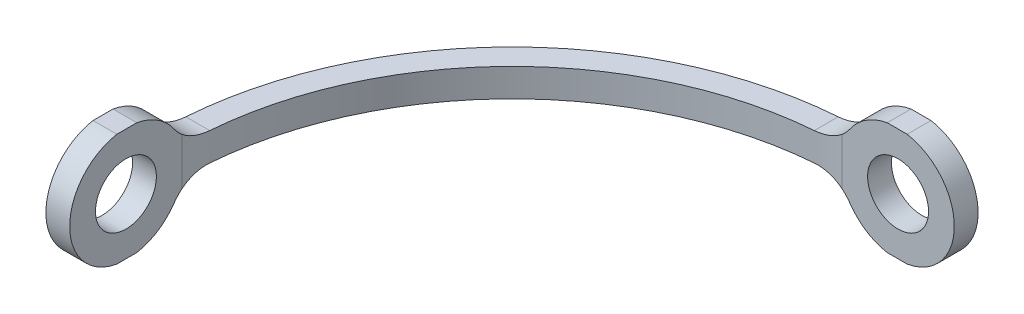
ISO-10303-21;
HEADER;
FILE_DESCRIPTION(('STEP AP214'),'2;1');
FILE_NAME('part.step','',(''),(''),'','','');
FILE_SCHEMA(('AUTOMOTIVE_DESIGN { 1 0 10303 214 1 1 1 1 }'));
ENDSEC;
DATA;
#1=APPLICATION_CONTEXT('core data for automotive mechanical design processes');
#2=APPLICATION_PROTOCOL_DEFINITION('international standard','automotive_design',2000,#1);
#3=PRODUCT_CONTEXT('',#1,'mechanical');
#4=PRODUCT('Part','Part','',(#3));
#5=PRODUCT_RELATED_PRODUCT_CATEGORY('part','',(#4));
#6=PRODUCT_DEFINITION_FORMATION('','',#4);
#7=PRODUCT_DEFINITION_CONTEXT('part definition',#1,'design');
#8=PRODUCT_DEFINITION('design','',#6,#7);
#9=PRODUCT_DEFINITION_SHAPE('','',#8);
#10=(LENGTH_UNIT() NAMED_UNIT(*) SI_UNIT(.MILLI.,.METRE.));
#11=(NAMED_UNIT(*) PLANE_ANGLE_UNIT() SI_UNIT($,.RADIAN.));
#12=(NAMED_UNIT(*) SI_UNIT($,.STERADIAN.) SOLID_ANGLE_UNIT());
#13=UNCERTAINTY_MEASURE_WITH_UNIT(LENGTH_MEASURE(1.E-05),#10,'distance_accuracy_value','');
#14=(GEOMETRIC_REPRESENTATION_CONTEXT(3) GLOBAL_UNCERTAINTY_ASSIGNED_CONTEXT((#13)) GLOBAL_UNIT_ASSIGNED_CONTEXT((#10,
#11,#12)) REPRESENTATION_CONTEXT('',''));
#15=CARTESIAN_POINT('',(0.,0.,0.));
#16=DIRECTION('',(0.,0.,1.));
#17=DIRECTION('',(1.,0.,0.));
#18=AXIS2_PLACEMENT_3D('',#15,#16,#17);
#19=CARTESIAN_POINT('',(-25.75,3.75,0.));
#20=DIRECTION('',(1.,0.,0.));
#21=DIRECTION('',(0.,0.,-1.));
#22=AXIS2_PLACEMENT_3D('',#19,#20,#21);
#23=PLANE('',#22);
#24=CARTESIAN_POINT('',(-25.75,0.,0.));
#25=DIRECTION('',(1.,0.,0.));
#26=DIRECTION('',(0.,0.,-1.));
#27=AXIS2_PLACEMENT_3D('',#24,#25,#26);
#28=CIRCLE('',#27,2.032);
#29=CARTESIAN_POINT('',(-25.75,0.,-2.032));
#30=VERTEX_POINT('',#29);
#31=EDGE_CURVE('E566',#30,#30,#28,.T.);
#32=ORIENTED_EDGE('',*,*,#31,.F.);
#33=EDGE_LOOP('',(#32));
#34=FACE_BOUND('',#33,.T.);
#35=DIRECTION('',(0.,0.,1.));
#36=VECTOR('',#35,1.);
#37=CARTESIAN_POINT('',(-25.75,3.75,0.));
#38=LINE('',#37,#36);
#39=CARTESIAN_POINT('',(-25.75,3.75,-0.724090821773479));
#40=VERTEX_POINT('',#39);
#41=CARTESIAN_POINT('',(-25.75,3.75,0.60690332177348));
#42=VERTEX_POINT('',#41);
#43=EDGE_CURVE('E329',#40,#42,#38,.T.);
#44=ORIENTED_EDGE('',*,*,#43,.T.);
#45=CARTESIAN_POINT('',(-25.75,0.,-0.0585937499999996));
#46=DIRECTION('',(1.,0.,0.));
#47=DIRECTION('',(0.,0.,-1.));
#48=AXIS2_PLACEMENT_3D('',#45,#46,#47);
#49=CIRCLE('',#48,3.80859375);
#50=CARTESIAN_POINT('',(-25.75,-3.75,0.60690332177348));
#51=VERTEX_POINT('',#50);
#52=EDGE_CURVE('E311',#42,#51,#49,.T.);
#53=ORIENTED_EDGE('',*,*,#52,.T.);
#54=DIRECTION('',(0.,0.,1.));
#55=VECTOR('',#54,1.);
#56=CARTESIAN_POINT('',(-25.75,-3.75,0.));
#57=LINE('',#56,#55);
#58=CARTESIAN_POINT('',(-25.75,-3.75,-0.724090821773479));
#59=VERTEX_POINT('',#58);
#60=EDGE_CURVE('E339',#59,#51,#57,.T.);
#61=ORIENTED_EDGE('',*,*,#60,.F.);
#62=CARTESIAN_POINT('',(-25.75,0.,-0.0585937499999996));
#63=DIRECTION('',(1.,0.,0.));
#64=DIRECTION('',(0.,0.,-1.));
#65=AXIS2_PLACEMENT_3D('',#62,#63,#64);
#66=CIRCLE('',#65,3.80859375);
#67=CARTESIAN_POINT('',(-25.75,-2.1570796460177,-3.1974460487352));
#68=VERTEX_POINT('',#67);
#69=EDGE_CURVE('E321',#59,#68,#66,.T.);
#70=ORIENTED_EDGE('',*,*,#69,.T.);
#71=CARTESIAN_POINT('',(-25.75,-3.75,-5.51536774626273));
#72=DIRECTION('',(1.,0.,0.));
#73=DIRECTION('',(0.,0.,-1.));
#74=AXIS2_PLACEMENT_3D('',#71,#72,#73);
#75=CIRCLE('',#74,2.8125);
#76=CARTESIAN_POINT('',(-25.75,-1.56056332120433,-3.75));
#77=VERTEX_POINT('',#76);
#78=EDGE_CURVE('E445',#68,#77,#75,.F.);
#79=ORIENTED_EDGE('',*,*,#78,.T.);
#80=DIRECTION('',(0.,-1.,0.));
#81=VECTOR('',#80,1.);
#82=CARTESIAN_POINT('',(-25.75,0.9375,-3.75));
#83=LINE('',#82,#81);
#84=CARTESIAN_POINT('',(-25.75,1.56056332120433,-3.75));
#85=VERTEX_POINT('',#84);
#86=EDGE_CURVE('E184',#85,#77,#83,.T.);
#87=ORIENTED_EDGE('',*,*,#86,.F.);
#88=CARTESIAN_POINT('',(-25.75,3.75,-5.51536774626273));
#89=DIRECTION('',(1.,0.,0.));
#90=DIRECTION('',(0.,0.,-1.));
#91=AXIS2_PLACEMENT_3D('',#88,#89,#90);
#92=CIRCLE('',#91,2.8125);
#93=CARTESIAN_POINT('',(-25.75,2.1570796460177,-3.1974460487352));
#94=VERTEX_POINT('',#93);
#95=EDGE_CURVE('E497',#85,#94,#92,.F.);
#96=ORIENTED_EDGE('',*,*,#95,.T.);
#97=CARTESIAN_POINT('',(-25.75,0.,-0.0585937499999996));
#98=DIRECTION('',(1.,0.,0.));
#99=DIRECTION('',(0.,0.,-1.));
#100=AXIS2_PLACEMENT_3D('',#97,#98,#99);
#101=CIRCLE('',#100,3.80859375);
#102=EDGE_CURVE('E581',#94,#40,#101,.T.);
#103=ORIENTED_EDGE('',*,*,#102,.T.);
#104=EDGE_LOOP('',(#44,#53,#61,#70,#79,#87,#96,#103));
#105=FACE_BOUND('',#104,.T.);
#106=ADVANCED_FACE('F155',(#34,#105),#23,.T.);
#107=CARTESIAN_POINT('',(-27.3375,3.75,0.));
#108=DIRECTION('',(1.,0.,0.));
#109=DIRECTION('',(0.,0.,-1.));
#110=AXIS2_PLACEMENT_3D('',#107,#108,#109);
#111=PLANE('',#110);
#112=CARTESIAN_POINT('',(-27.3375,0.,0.));
#113=DIRECTION('',(1.,0.,0.));
#114=DIRECTION('',(0.,0.,-1.));
#115=AXIS2_PLACEMENT_3D('',#112,#113,#114);
#116=CIRCLE('',#115,2.032);
#117=CARTESIAN_POINT('',(-27.3375,0.,-2.032));
#118=VERTEX_POINT('',#117);
#119=EDGE_CURVE('E560',#118,#118,#116,.T.);
#120=ORIENTED_EDGE('',*,*,#119,.T.);
#121=EDGE_LOOP('',(#120));
#122=FACE_BOUND('',#121,.T.);
#123=CARTESIAN_POINT('',(-27.3375,0.,-0.0585937499999996));
#124=DIRECTION('',(1.,0.,0.));
#125=DIRECTION('',(0.,0.,-1.));
#126=AXIS2_PLACEMENT_3D('',#123,#124,#125);
#127=CIRCLE('',#126,3.80859375);
#128=CARTESIAN_POINT('',(-27.3375,3.75,0.60690332177348));
#129=VERTEX_POINT('',#128);
#130=CARTESIAN_POINT('',(-27.3375,-3.75,0.60690332177348));
#131=VERTEX_POINT('',#130);
#132=EDGE_CURVE('E298',#129,#131,#127,.T.);
#133=ORIENTED_EDGE('',*,*,#132,.F.);
#134=DIRECTION('',(0.,0.,1.));
#135=VECTOR('',#134,1.);
#136=CARTESIAN_POINT('',(-27.3375,3.75,0.));
#137=LINE('',#136,#135);
#138=CARTESIAN_POINT('',(-27.3375,3.75,-0.724090821773479));
#139=VERTEX_POINT('',#138);
#140=EDGE_CURVE('E303',#139,#129,#137,.T.);
#141=ORIENTED_EDGE('',*,*,#140,.F.);
#142=CARTESIAN_POINT('',(-27.3375,0.,-0.0585937499999996));
#143=DIRECTION('',(1.,0.,0.));
#144=DIRECTION('',(0.,0.,-1.));
#145=AXIS2_PLACEMENT_3D('',#142,#143,#144);
#146=CIRCLE('',#145,3.80859375);
#147=CARTESIAN_POINT('',(-27.3375,2.1570796460177,-3.1974460487352));
#148=VERTEX_POINT('',#147);
#149=EDGE_CURVE('E493',#148,#139,#146,.T.);
#150=ORIENTED_EDGE('',*,*,#149,.F.);
#151=CARTESIAN_POINT('',(-27.3375,3.75,-5.51536774626273));
#152=DIRECTION('',(1.,0.,0.));
#153=DIRECTION('',(0.,0.,-1.));
#154=AXIS2_PLACEMENT_3D('',#151,#152,#153);
#155=CIRCLE('',#154,2.8125);
#156=CARTESIAN_POINT('',(-27.3375,1.56056332120433,-3.75));
#157=VERTEX_POINT('',#156);
#158=EDGE_CURVE('E170',#148,#157,#155,.T.);
#159=ORIENTED_EDGE('',*,*,#158,.T.);
#160=DIRECTION('',(0.,-1.,0.));
#161=VECTOR('',#160,1.);
#162=CARTESIAN_POINT('',(-27.3375,0.9375,-3.75));
#163=LINE('',#162,#161);
#164=CARTESIAN_POINT('',(-27.3375,-1.56056332120433,-3.75));
#165=VERTEX_POINT('',#164);
#166=EDGE_CURVE('E176',#157,#165,#163,.T.);
#167=ORIENTED_EDGE('',*,*,#166,.T.);
#168=CARTESIAN_POINT('',(-27.3375,-3.75,-5.51536774626273));
#169=DIRECTION('',(1.,0.,0.));
#170=DIRECTION('',(0.,0.,-1.));
#171=AXIS2_PLACEMENT_3D('',#168,#169,#170);
#172=CIRCLE('',#171,2.8125);
#173=CARTESIAN_POINT('',(-27.3375,-2.1570796460177,-3.1974460487352));
#174=VERTEX_POINT('',#173);
#175=EDGE_CURVE('E419',#165,#174,#172,.T.);
#176=ORIENTED_EDGE('',*,*,#175,.T.);
#177=CARTESIAN_POINT('',(-27.3375,0.,-0.0585937499999996));
#178=DIRECTION('',(1.,0.,0.));
#179=DIRECTION('',(0.,0.,-1.));
#180=AXIS2_PLACEMENT_3D('',#177,#178,#179);
#181=CIRCLE('',#180,3.80859375);
#182=CARTESIAN_POINT('',(-27.3375,-3.75,-0.724090821773479));
#183=VERTEX_POINT('',#182);
#184=EDGE_CURVE('E582',#183,#174,#181,.T.);
#185=ORIENTED_EDGE('',*,*,#184,.F.);
#186=DIRECTION('',(0.,0.,1.));
#187=VECTOR('',#186,1.);
#188=CARTESIAN_POINT('',(-27.3375,-3.75,0.));
#189=LINE('',#188,#187);
#190=EDGE_CURVE('E306',#183,#131,#189,.T.);
#191=ORIENTED_EDGE('',*,*,#190,.T.);
#192=EDGE_LOOP('',(#133,#141,#150,#159,#167,#176,#185,#191));
#193=FACE_BOUND('',#192,.T.);
#194=ADVANCED_FACE('F300',(#122,#193),#111,.F.);
#195=CARTESIAN_POINT('',(0.,3.75,0.));
#196=DIRECTION('',(0.,1.,0.));
#197=DIRECTION('',(0.,0.,1.));
#198=AXIS2_PLACEMENT_3D('',#195,#196,#197);
#199=PLANE('',#198);
#200=ORIENTED_EDGE('',*,*,#140,.T.);
#201=DIRECTION('',(1.,0.,0.));
#202=VECTOR('',#201,1.);
#203=CARTESIAN_POINT('',(-27.3375,3.75,0.60690332177348));
#204=LINE('',#203,#202);
#205=EDGE_CURVE('E314',#129,#42,#204,.T.);
#206=ORIENTED_EDGE('',*,*,#205,.T.);
#207=ORIENTED_EDGE('',*,*,#43,.F.);
#208=DIRECTION('',(1.,0.,0.));
#209=VECTOR('',#208,1.);
#210=CARTESIAN_POINT('',(-27.3375,3.75,-0.724090821773479));
#211=LINE('',#210,#209);
#212=EDGE_CURVE('E326',#139,#40,#211,.T.);
#213=ORIENTED_EDGE('',*,*,#212,.F.);
#214=EDGE_LOOP('',(#200,#206,#207,#213));
#215=FACE_BOUND('',#214,.T.);
#216=ADVANCED_FACE('F324',(#215),#199,.T.);
#217=CARTESIAN_POINT('',(0.,-3.75,0.));
#218=DIRECTION('',(0.,1.,0.));
#219=DIRECTION('',(0.,0.,1.));
#220=AXIS2_PLACEMENT_3D('',#217,#218,#219);
#221=PLANE('',#220);
#222=DIRECTION('',(1.,0.,0.));
#223=VECTOR('',#222,1.);
#224=CARTESIAN_POINT('',(-27.3375,-3.75,-0.724090821773479));
#225=LINE('',#224,#223);
#226=EDGE_CURVE('E577',#183,#59,#225,.T.);
#227=ORIENTED_EDGE('',*,*,#226,.T.);
#228=ORIENTED_EDGE('',*,*,#60,.T.);
#229=DIRECTION('',(1.,0.,0.));
#230=VECTOR('',#229,1.);
#231=CARTESIAN_POINT('',(-27.3375,-3.75,0.60690332177348));
#232=LINE('',#231,#230);
#233=EDGE_CURVE('E310',#131,#51,#232,.T.);
#234=ORIENTED_EDGE('',*,*,#233,.F.);
#235=ORIENTED_EDGE('',*,*,#190,.F.);
#236=EDGE_LOOP('',(#227,#228,#234,#235));
#237=FACE_BOUND('',#236,.T.);
#238=ADVANCED_FACE('F660',(#237),#221,.F.);
#239=CARTESIAN_POINT('',(0.,3.75,-25.75));
#240=DIRECTION('',(0.,0.,-1.));
#241=DIRECTION('',(-1.,0.,0.));
#242=AXIS2_PLACEMENT_3D('',#239,#240,#241);
#243=PLANE('',#242);
#244=CARTESIAN_POINT('',(0.,0.,-25.75));
#245=DIRECTION('',(0.,0.,1.));
#246=DIRECTION('',(1.,0.,0.));
#247=AXIS2_PLACEMENT_3D('',#244,#245,#246);
#248=CIRCLE('',#247,2.032);
#249=CARTESIAN_POINT('',(2.032,0.,-25.75));
#250=VERTEX_POINT('',#249);
#251=EDGE_CURVE('E522',#250,#250,#248,.T.);
#252=ORIENTED_EDGE('',*,*,#251,.F.);
#253=EDGE_LOOP('',(#252));
#254=FACE_BOUND('',#253,.T.);
#255=DIRECTION('',(1.,0.,0.));
#256=VECTOR('',#255,1.);
#257=CARTESIAN_POINT('',(0.,-3.75,-25.75));
#258=LINE('',#257,#256);
#259=CARTESIAN_POINT('',(-0.724090821773469,-3.75,-25.75));
#260=VERTEX_POINT('',#259);
#261=CARTESIAN_POINT('',(0.606903321773469,-3.75,-25.75));
#262=VERTEX_POINT('',#261);
#263=EDGE_CURVE('E514',#260,#262,#258,.T.);
#264=ORIENTED_EDGE('',*,*,#263,.T.);
#265=CARTESIAN_POINT('',(-0.0585937500000001,0.,-25.75));
#266=DIRECTION('',(0.,0.,1.));
#267=DIRECTION('',(1.,0.,0.));
#268=AXIS2_PLACEMENT_3D('',#265,#266,#267);
#269=CIRCLE('',#268,3.80859375);
#270=CARTESIAN_POINT('',(0.606903321773469,3.75,-25.75));
#271=VERTEX_POINT('',#270);
#272=EDGE_CURVE('E535',#262,#271,#269,.T.);
#273=ORIENTED_EDGE('',*,*,#272,.T.);
#274=DIRECTION('',(1.,0.,0.));
#275=VECTOR('',#274,1.);
#276=CARTESIAN_POINT('',(0.,3.75,-25.75));
#277=LINE('',#276,#275);
#278=CARTESIAN_POINT('',(-0.724090821773469,3.75,-25.75));
#279=VERTEX_POINT('',#278);
#280=EDGE_CURVE('E476',#279,#271,#277,.T.);
#281=ORIENTED_EDGE('',*,*,#280,.F.);
#282=CARTESIAN_POINT('',(-0.0585937500000001,0.,-25.75));
#283=DIRECTION('',(0.,0.,1.));
#284=DIRECTION('',(1.,0.,0.));
#285=AXIS2_PLACEMENT_3D('',#282,#283,#284);
#286=CIRCLE('',#285,3.80859375);
#287=CARTESIAN_POINT('',(-3.19744604873519,2.1570796460177,-25.75));
#288=VERTEX_POINT('',#287);
#289=EDGE_CURVE('E533',#279,#288,#286,.T.);
#290=ORIENTED_EDGE('',*,*,#289,.T.);
#291=CARTESIAN_POINT('',(-5.51536774626272,3.75,-25.75));
#292=DIRECTION('',(0.,0.,-1.));
#293=DIRECTION('',(-1.,0.,0.));
#294=AXIS2_PLACEMENT_3D('',#291,#292,#293);
#295=CIRCLE('',#294,2.8125);
#296=CARTESIAN_POINT('',(-3.75,1.56056332120433,-25.75));
#297=VERTEX_POINT('',#296);
#298=EDGE_CURVE('E446',#288,#297,#295,.T.);
#299=ORIENTED_EDGE('',*,*,#298,.T.);
#300=DIRECTION('',(0.,-1.,0.));
#301=VECTOR('',#300,1.);
#302=CARTESIAN_POINT('',(-3.75,0.9375,-25.75));
#303=LINE('',#302,#301);
#304=CARTESIAN_POINT('',(-3.75,-1.56056332120433,-25.75));
#305=VERTEX_POINT('',#304);
#306=EDGE_CURVE('E485',#297,#305,#303,.T.);
#307=ORIENTED_EDGE('',*,*,#306,.T.);
#308=CARTESIAN_POINT('',(-5.51536774626272,-3.75,-25.75));
#309=DIRECTION('',(0.,0.,-1.));
#310=DIRECTION('',(-1.,0.,0.));
#311=AXIS2_PLACEMENT_3D('',#308,#309,#310);
#312=CIRCLE('',#311,2.8125);
#313=CARTESIAN_POINT('',(-3.19744604873519,-2.1570796460177,-25.75));
#314=VERTEX_POINT('',#313);
#315=EDGE_CURVE('E611',#305,#314,#312,.T.);
#316=ORIENTED_EDGE('',*,*,#315,.T.);
#317=CARTESIAN_POINT('',(-0.0585937500000001,0.,-25.75));
#318=DIRECTION('',(0.,0.,1.));
#319=DIRECTION('',(1.,0.,0.));
#320=AXIS2_PLACEMENT_3D('',#317,#318,#319);
#321=CIRCLE('',#320,3.80859375);
#322=EDGE_CURVE('E557',#314,#260,#321,.T.);
#323=ORIENTED_EDGE('',*,*,#322,.T.);
#324=EDGE_LOOP('',(#264,#273,#281,#290,#299,#307,#316,#323));
#325=FACE_BOUND('',#324,.T.);
#326=ADVANCED_FACE('F632',(#254,#325),#243,.F.);
#327=CARTESIAN_POINT('',(0.,3.75,-27.3375));
#328=DIRECTION('',(0.,0.,-1.));
#329=DIRECTION('',(-1.,0.,0.));
#330=AXIS2_PLACEMENT_3D('',#327,#328,#329);
#331=PLANE('',#330);
#332=CARTESIAN_POINT('',(0.,0.,-27.3375));
#333=DIRECTION('',(0.,0.,1.));
#334=DIRECTION('',(1.,0.,0.));
#335=AXIS2_PLACEMENT_3D('',#332,#333,#334);
#336=CIRCLE('',#335,2.032);
#337=CARTESIAN_POINT('',(2.032,0.,-27.3375));
#338=VERTEX_POINT('',#337);
#339=EDGE_CURVE('E517',#338,#338,#336,.T.);
#340=ORIENTED_EDGE('',*,*,#339,.T.);
#341=EDGE_LOOP('',(#340));
#342=FACE_BOUND('',#341,.T.);
#343=CARTESIAN_POINT('',(-0.0585937500000001,0.,-27.3375));
#344=DIRECTION('',(0.,0.,1.));
#345=DIRECTION('',(1.,0.,0.));
#346=AXIS2_PLACEMENT_3D('',#343,#344,#345);
#347=CIRCLE('',#346,3.80859375);
#348=CARTESIAN_POINT('',(0.606903321773469,-3.75,-27.3375));
#349=VERTEX_POINT('',#348);
#350=CARTESIAN_POINT('',(0.606903321773469,3.75,-27.3375));
#351=VERTEX_POINT('',#350);
#352=EDGE_CURVE('E534',#349,#351,#347,.T.);
#353=ORIENTED_EDGE('',*,*,#352,.F.);
#354=DIRECTION('',(1.,0.,0.));
#355=VECTOR('',#354,1.);
#356=CARTESIAN_POINT('',(0.,-3.75,-27.3375));
#357=LINE('',#356,#355);
#358=CARTESIAN_POINT('',(-0.724090821773469,-3.75,-27.3375));
#359=VERTEX_POINT('',#358);
#360=EDGE_CURVE('E510',#359,#349,#357,.T.);
#361=ORIENTED_EDGE('',*,*,#360,.F.);
#362=CARTESIAN_POINT('',(-0.0585937500000001,0.,-27.3375));
#363=DIRECTION('',(0.,0.,1.));
#364=DIRECTION('',(1.,0.,0.));
#365=AXIS2_PLACEMENT_3D('',#362,#363,#364);
#366=CIRCLE('',#365,3.80859375);
#367=CARTESIAN_POINT('',(-3.19744604873519,-2.1570796460177,-27.3375));
#368=VERTEX_POINT('',#367);
#369=EDGE_CURVE('E556',#368,#359,#366,.T.);
#370=ORIENTED_EDGE('',*,*,#369,.F.);
#371=CARTESIAN_POINT('',(-5.51536774626272,-3.75,-27.3375));
#372=DIRECTION('',(0.,0.,-1.));
#373=DIRECTION('',(-1.,0.,0.));
#374=AXIS2_PLACEMENT_3D('',#371,#372,#373);
#375=CIRCLE('',#374,2.8125);
#376=CARTESIAN_POINT('',(-3.75,-1.56056332120433,-27.3375));
#377=VERTEX_POINT('',#376);
#378=EDGE_CURVE('E368',#368,#377,#375,.F.);
#379=ORIENTED_EDGE('',*,*,#378,.T.);
#380=DIRECTION('',(0.,-1.,0.));
#381=VECTOR('',#380,1.);
#382=CARTESIAN_POINT('',(-3.75,0.9375,-27.3375));
#383=LINE('',#382,#381);
#384=CARTESIAN_POINT('',(-3.75,1.56056332120433,-27.3375));
#385=VERTEX_POINT('',#384);
#386=EDGE_CURVE('E482',#385,#377,#383,.T.);
#387=ORIENTED_EDGE('',*,*,#386,.F.);
#388=CARTESIAN_POINT('',(-5.51536774626272,3.75,-27.3375));
#389=DIRECTION('',(0.,0.,-1.));
#390=DIRECTION('',(-1.,0.,0.));
#391=AXIS2_PLACEMENT_3D('',#388,#389,#390);
#392=CIRCLE('',#391,2.8125);
#393=CARTESIAN_POINT('',(-3.19744604873519,2.1570796460177,-27.3375));
#394=VERTEX_POINT('',#393);
#395=EDGE_CURVE('E609',#385,#394,#392,.F.);
#396=ORIENTED_EDGE('',*,*,#395,.T.);
#397=CARTESIAN_POINT('',(-0.0585937500000001,0.,-27.3375));
#398=DIRECTION('',(0.,0.,1.));
#399=DIRECTION('',(1.,0.,0.));
#400=AXIS2_PLACEMENT_3D('',#397,#398,#399);
#401=CIRCLE('',#400,3.80859375);
#402=CARTESIAN_POINT('',(-0.724090821773469,3.75,-27.3375));
#403=VERTEX_POINT('',#402);
#404=EDGE_CURVE('E545',#403,#394,#401,.T.);
#405=ORIENTED_EDGE('',*,*,#404,.F.);
#406=DIRECTION('',(1.,0.,0.));
#407=VECTOR('',#406,1.);
#408=CARTESIAN_POINT('',(0.,3.75,-27.3375));
#409=LINE('',#408,#407);
#410=EDGE_CURVE('E472',#403,#351,#409,.T.);
#411=ORIENTED_EDGE('',*,*,#410,.T.);
#412=EDGE_LOOP('',(#353,#361,#370,#379,#387,#396,#405,#411));
#413=FACE_BOUND('',#412,.T.);
#414=ADVANCED_FACE('F627',(#342,#413),#331,.T.);
#415=CARTESIAN_POINT('',(0.,-3.75,0.));
#416=DIRECTION('',(0.,1.,0.));
#417=DIRECTION('',(0.,0.,1.));
#418=AXIS2_PLACEMENT_3D('',#415,#416,#417);
#419=PLANE('',#418);
#420=DIRECTION('',(0.,0.,1.));
#421=VECTOR('',#420,1.);
#422=CARTESIAN_POINT('',(0.606903321773469,-3.75,-27.3375));
#423=LINE('',#422,#421);
#424=EDGE_CURVE('E539',#349,#262,#423,.T.);
#425=ORIENTED_EDGE('',*,*,#424,.T.);
#426=ORIENTED_EDGE('',*,*,#263,.F.);
#427=DIRECTION('',(0.,0.,1.));
#428=VECTOR('',#427,1.);
#429=CARTESIAN_POINT('',(-0.724090821773469,-3.75,-27.3375));
#430=LINE('',#429,#428);
#431=EDGE_CURVE('E552',#359,#260,#430,.T.);
#432=ORIENTED_EDGE('',*,*,#431,.F.);
#433=ORIENTED_EDGE('',*,*,#360,.T.);
#434=EDGE_LOOP('',(#425,#426,#432,#433));
#435=FACE_BOUND('',#434,.T.);
#436=ADVANCED_FACE('F630',(#435),#419,.F.);
#437=CARTESIAN_POINT('',(0.,3.75,0.));
#438=DIRECTION('',(0.,1.,0.));
#439=DIRECTION('',(0.,0.,1.));
#440=AXIS2_PLACEMENT_3D('',#437,#438,#439);
#441=PLANE('',#440);
#442=ORIENTED_EDGE('',*,*,#280,.T.);
#443=DIRECTION('',(0.,0.,1.));
#444=VECTOR('',#443,1.);
#445=CARTESIAN_POINT('',(0.606903321773469,3.75,-27.3375));
#446=LINE('',#445,#444);
#447=EDGE_CURVE('E530',#351,#271,#446,.T.);
#448=ORIENTED_EDGE('',*,*,#447,.F.);
#449=ORIENTED_EDGE('',*,*,#410,.F.);
#450=DIRECTION('',(0.,0.,1.));
#451=VECTOR('',#450,1.);
#452=CARTESIAN_POINT('',(-0.724090821773469,3.75,-27.3375));
#453=LINE('',#452,#451);
#454=EDGE_CURVE('E526',#403,#279,#453,.T.);
#455=ORIENTED_EDGE('',*,*,#454,.T.);
#456=EDGE_LOOP('',(#442,#448,#449,#455));
#457=FACE_BOUND('',#456,.T.);
#458=ADVANCED_FACE('F396',(#457),#441,.T.);
#459=CARTESIAN_POINT('',(-3.75,0.9375,-3.75));
#460=DIRECTION('',(0.,-1.,0.));
#461=DIRECTION('',(0.,0.,-1.));
#462=AXIS2_PLACEMENT_3D('',#459,#460,#461);
#463=CYLINDRICAL_SURFACE('',#462,23.5875);
#464=CARTESIAN_POINT('',(-3.75,-0.9375,-3.75));
#465=DIRECTION('',(0.,1.,0.));
#466=DIRECTION('',(0.,0.,1.));
#467=AXIS2_PLACEMENT_3D('',#464,#465,#466);
#468=CIRCLE('',#467,23.5875);
#469=CARTESIAN_POINT('',(-27.2713441999061,-0.9375,-5.51536774626273));
#470=VERTEX_POINT('',#469);
#471=CARTESIAN_POINT('',(-5.51536774626272,-0.9375,-27.2713441999061));
#472=VERTEX_POINT('',#471);
#473=EDGE_CURVE('E465',#470,#472,#468,.F.);
#474=ORIENTED_EDGE('',*,*,#473,.F.);
#475=CARTESIAN_POINT('',(-27.2713441999061,-0.9375,-5.51536774626273));
#476=CARTESIAN_POINT('',(-27.2773225416373,-0.937503524689456,-5.43573945426251));
#477=CARTESIAN_POINT('',(-27.2828883329417,-0.94088492045854,-5.35612997857985));
#478=CARTESIAN_POINT('',(-27.2931815349549,-0.954390721524354,-5.19743691837847));
#479=CARTESIAN_POINT('',(-27.2979090085136,-0.964514621053199,-5.11835329486393));
#480=CARTESIAN_POINT('',(-27.3105676640318,-1.00420532121716,-4.88712867611587));
#481=CARTESIAN_POINT('',(-27.3173192354674,-1.04310391156297,-4.73637707532486));
#482=CARTESIAN_POINT('',(-27.3252080071566,-1.1201747095686,-4.51511867426764));
#483=CARTESIAN_POINT('',(-27.3274767338766,-1.14942115123957,-4.44138314825104));
#484=CARTESIAN_POINT('',(-27.3312767504036,-1.21405299429624,-4.29659698342586));
#485=CARTESIAN_POINT('',(-27.3328079880099,-1.24943882999628,-4.22554653499898));
#486=CARTESIAN_POINT('',(-27.3352342963725,-1.32721971949823,-4.08464867438919));
#487=CARTESIAN_POINT('',(-27.3361093639013,-1.36979009787107,-4.01489786969938));
#488=CARTESIAN_POINT('',(-27.3372432074049,-1.46083341070348,-3.87935102433117));
#489=CARTESIAN_POINT('',(-27.3375019534761,-1.50930663144694,-3.8135551756968));
#490=CARTESIAN_POINT('',(-27.3375,-1.56056332120443,-3.75000000000003));
#491=B_SPLINE_CURVE_WITH_KNOTS('',3,(#475,#476,#477,#478,#479,#480,#481,#482,#483,#484,#485,
#486,#487,#488,#489,#490),.UNSPECIFIED.,.F.,.F.,(4,2,2,2,2,2,2,4),(0.,0.239385159698951,
0.478752364689094,0.943708958581238,1.18155738475111,1.41942264371199,1.66427340460255,
1.90913604532311),.UNSPECIFIED.);
#492=EDGE_CURVE('E411',#470,#165,#491,.T.);
#493=ORIENTED_EDGE('',*,*,#492,.T.);
#494=ORIENTED_EDGE('',*,*,#166,.F.);
#495=CARTESIAN_POINT('',(-27.3375,1.56056332120433,-3.75));
#496=CARTESIAN_POINT('',(-27.3375000503721,1.51044464843646,-3.81216374862562));
#497=CARTESIAN_POINT('',(-27.3372537159481,1.46300152866283,-3.87642050667379));
#498=CARTESIAN_POINT('',(-27.3361740718443,1.37375089662105,-4.00872329988781));
#499=CARTESIAN_POINT('',(-27.3353408066371,1.33194295765339,-4.07676904759695));
#500=CARTESIAN_POINT('',(-27.3318868502698,1.21762413921695,-4.28199468841479));
#501=CARTESIAN_POINT('',(-27.3283217181199,1.15331104514143,-4.42389167265505));
#502=CARTESIAN_POINT('',(-27.3206506550887,1.07452638043821,-4.64455161193603));
#503=CARTESIAN_POINT('',(-27.3176593776472,1.05105349289799,-4.72029963893358));
#504=CARTESIAN_POINT('',(-27.3108523382039,1.01057834595539,-4.87350275072746));
#505=CARTESIAN_POINT('',(-27.3070365178976,0.993576544366295,-4.95095795589245));
#506=CARTESIAN_POINT('',(-27.2984394784049,0.965778798951406,-5.10926877836072));
#507=CARTESIAN_POINT('',(-27.2936332002015,0.955179755444788,-5.19015745816023));
#508=CARTESIAN_POINT('',(-27.2831432508908,0.941035670124713,-5.35249664298895));
#509=CARTESIAN_POINT('',(-27.2774595375702,0.937490967808762,-5.4339471748686));
#510=CARTESIAN_POINT('',(-27.2713441999061,0.9375,-5.51536774626273));
#511=B_SPLINE_CURVE_WITH_KNOTS('',3,(#495,#496,#497,#498,#499,#500,#501,#502,#503,#504,#505,
#506,#507,#508,#509,#510),.UNSPECIFIED.,.F.,.F.,(4,2,2,2,2,2,2,4),(0.,0.239380817323157,
0.478743498382168,0.943690843418679,1.18154402480405,1.41941403058578,1.66426924088854,
1.90913623481804),.UNSPECIFIED.);
#512=CARTESIAN_POINT('',(-27.2713441999061,0.9375,-5.51536774626273));
#513=VERTEX_POINT('',#512);
#514=EDGE_CURVE('E12',#157,#513,#511,.T.);
#515=ORIENTED_EDGE('',*,*,#514,.T.);
#516=CARTESIAN_POINT('',(-3.75,0.9375,-3.75));
#517=DIRECTION('',(0.,1.,0.));
#518=DIRECTION('',(0.,0.,1.));
#519=AXIS2_PLACEMENT_3D('',#516,#517,#518);
#520=CIRCLE('',#519,23.5875);
#521=CARTESIAN_POINT('',(-5.51536774626272,0.9375,-27.2713441999061));
#522=VERTEX_POINT('',#521);
#523=EDGE_CURVE('E464',#513,#522,#520,.F.);
#524=ORIENTED_EDGE('',*,*,#523,.T.);
#525=CARTESIAN_POINT('',(-5.51536774626272,0.9375,-27.2713441999061));
#526=CARTESIAN_POINT('',(-5.43573945426251,0.937503524689456,-27.2773225416373));
#527=CARTESIAN_POINT('',(-5.35612997857985,0.94088492045854,-27.2828883329417));
#528=CARTESIAN_POINT('',(-5.19743691837846,0.954390721524354,-27.2931815349549));
#529=CARTESIAN_POINT('',(-5.11835329486393,0.964514621053199,-27.2979090085136));
#530=CARTESIAN_POINT('',(-4.88712867611587,1.00420532121716,-27.3105676640319));
#531=CARTESIAN_POINT('',(-4.73637707532486,1.04310391156297,-27.3173192354674));
#532=CARTESIAN_POINT('',(-4.51511867426764,1.1201747095686,-27.3252080071566));
#533=CARTESIAN_POINT('',(-4.44138314825104,1.14942115123957,-27.3274767338766));
#534=CARTESIAN_POINT('',(-4.29659698342586,1.21405299429624,-27.3312767504036));
#535=CARTESIAN_POINT('',(-4.22554653499898,1.24943882999628,-27.3328079880099));
#536=CARTESIAN_POINT('',(-4.08464867438919,1.32721971949823,-27.3352342963725));
#537=CARTESIAN_POINT('',(-4.01489786969938,1.36979009787107,-27.3361093639013));
#538=CARTESIAN_POINT('',(-3.87935102433117,1.46083341070348,-27.3372432074049));
#539=CARTESIAN_POINT('',(-3.8135551756968,1.50930663144693,-27.3375019534761));
#540=CARTESIAN_POINT('',(-3.75000000000003,1.56056332120443,-27.3375));
#541=B_SPLINE_CURVE_WITH_KNOTS('',3,(#525,#526,#527,#528,#529,#530,#531,#532,#533,#534,#535,
#536,#537,#538,#539,#540),.UNSPECIFIED.,.F.,.F.,(4,2,2,2,2,2,2,4),(0.,0.239385159698951,
0.478752364689094,0.943708958581238,1.1815573847511,1.41942264371199,1.66427340460255,
1.90913604532311),.UNSPECIFIED.);
#542=EDGE_CURVE('E404',#522,#385,#541,.T.);
#543=ORIENTED_EDGE('',*,*,#542,.T.);
#544=ORIENTED_EDGE('',*,*,#386,.T.);
#545=CARTESIAN_POINT('',(-3.75,-1.56056332120433,-27.3375));
#546=CARTESIAN_POINT('',(-3.81216374862562,-1.51044464843645,-27.3375000503721));
#547=CARTESIAN_POINT('',(-3.87642050667379,-1.46300152866283,-27.3372537159481));
#548=CARTESIAN_POINT('',(-4.00872329988781,-1.37375089662105,-27.3361740718443));
#549=CARTESIAN_POINT('',(-4.07676904759695,-1.33194295765339,-27.3353408066371));
#550=CARTESIAN_POINT('',(-4.28199468841479,-1.21762413921695,-27.3318868502698));
#551=CARTESIAN_POINT('',(-4.42389167265505,-1.15331104514142,-27.3283217181199));
#552=CARTESIAN_POINT('',(-4.64455161193603,-1.07452638043821,-27.3206506550887));
#553=CARTESIAN_POINT('',(-4.72029963893359,-1.05105349289799,-27.3176593776472));
#554=CARTESIAN_POINT('',(-4.87350275072746,-1.01057834595539,-27.3108523382039));
#555=CARTESIAN_POINT('',(-4.95095795589245,-0.993576544366295,-27.3070365178976));
#556=CARTESIAN_POINT('',(-5.10926877836072,-0.965778798951406,-27.2984394784049));
#557=CARTESIAN_POINT('',(-5.19015745816023,-0.955179755444788,-27.2936332002015));
#558=CARTESIAN_POINT('',(-5.35249664298895,-0.941035670124712,-27.2831432508908));
#559=CARTESIAN_POINT('',(-5.43394717486859,-0.937490967808761,-27.2774595375702));
#560=CARTESIAN_POINT('',(-5.51536774626272,-0.9375,-27.2713441999061));
#561=B_SPLINE_CURVE_WITH_KNOTS('',3,(#545,#546,#547,#548,#549,#550,#551,#552,#553,#554,#555,
#556,#557,#558,#559,#560),.UNSPECIFIED.,.F.,.F.,(4,2,2,2,2,2,2,4),(0.,0.239380817323157,
0.478743498382169,0.943690843418679,1.18154402480406,1.41941403058578,1.66426924088853,
1.90913623481803),.UNSPECIFIED.);
#562=EDGE_CURVE('E372',#377,#472,#561,.T.);
#563=ORIENTED_EDGE('',*,*,#562,.T.);
#564=EDGE_LOOP('',(#474,#493,#494,#515,#524,#543,#544,#563));
#565=FACE_BOUND('',#564,.T.);
#566=ADVANCED_FACE('F391',(#565),#463,.T.);
#567=CARTESIAN_POINT('',(-3.75,0.9375,-3.75));
#568=DIRECTION('',(0.,-1.,0.));
#569=DIRECTION('',(0.,0.,-1.));
#570=AXIS2_PLACEMENT_3D('',#567,#568,#569);
#571=CYLINDRICAL_SURFACE('',#570,22.);
#572=ORIENTED_EDGE('',*,*,#86,.T.);
#573=CARTESIAN_POINT('',(-25.75,-1.56056332120433,-3.75));
#574=CARTESIAN_POINT('',(-25.7500000524824,-1.51047932454128,-3.81212070232947));
#575=CARTESIAN_POINT('',(-25.7497363098632,-1.46306716858529,-3.87633160571687));
#576=CARTESIAN_POINT('',(-25.7485804294459,-1.37387067231097,-4.00853734509375));
#577=CARTESIAN_POINT('',(-25.7476883383013,-1.33208591444415,-4.07653189980964));
#578=CARTESIAN_POINT('',(-25.7439907101062,-1.21782553454914,-4.28159556733557));
#579=CARTESIAN_POINT('',(-25.740174226576,-1.15353601599093,-4.42337412397028));
#580=CARTESIAN_POINT('',(-25.7319581227221,-1.07471698247188,-4.64396023413289));
#581=CARTESIAN_POINT('',(-25.7287502341905,-1.05120959752143,-4.71976387177482));
#582=CARTESIAN_POINT('',(-25.7214490469021,-1.01067637096634,-4.87307705630049));
#583=CARTESIAN_POINT('',(-25.7173556828759,-0.993651007415587,-4.95058672855978));
#584=CARTESIAN_POINT('',(-25.7081320427395,-0.965814809629557,-5.10900950244622));
#585=CARTESIAN_POINT('',(-25.7029747871984,-0.955201691907193,-5.18995562159829));
#586=CARTESIAN_POINT('',(-25.6917180543588,-0.941039558021105,-5.35240207438795));
#587=CARTESIAN_POINT('',(-25.6856185351718,-0.937490856003927,-5.43390243251021));
#588=CARTESIAN_POINT('',(-25.6790555364442,-0.9375,-5.51536774626273));
#589=B_SPLINE_CURVE_WITH_KNOTS('',3,(#573,#574,#575,#576,#577,#578,#579,#580,#581,#582,#583,
#584,#585,#586,#587,#588),.UNSPECIFIED.,.F.,.F.,(4,2,2,2,2,2,2,4),(0.,0.239215320017626,
0.478412880656157,0.943027178242157,1.18109435906842,1.41917909412631,1.66427319737444,
1.90937819943562),.UNSPECIFIED.);
#590=CARTESIAN_POINT('',(-25.6790555364442,-0.9375,-5.51536774626273));
#591=VERTEX_POINT('',#590);
#592=EDGE_CURVE('E420',#77,#591,#589,.T.);
#593=ORIENTED_EDGE('',*,*,#592,.T.);
#594=CARTESIAN_POINT('',(-3.75,-0.9375,-3.75));
#595=DIRECTION('',(0.,1.,0.));
#596=DIRECTION('',(0.,0.,1.));
#597=AXIS2_PLACEMENT_3D('',#594,#595,#596);
#598=CIRCLE('',#597,22.);
#599=CARTESIAN_POINT('',(-5.51536774626272,-0.9375,-25.6790555364442));
#600=VERTEX_POINT('',#599);
#601=EDGE_CURVE('E455',#591,#600,#598,.F.);
#602=ORIENTED_EDGE('',*,*,#601,.T.);
#603=CARTESIAN_POINT('',(-5.51536774626272,-0.9375,-25.6790555364442));
#604=CARTESIAN_POINT('',(-5.43582794306472,-0.937503484266612,-25.6854608386535));
#605=CARTESIAN_POINT('',(-5.35630219138192,-0.940877416486521,-25.6914246383923));
#606=CARTESIAN_POINT('',(-5.19776672061802,-0.954355508156149,-25.7024549245035));
#607=CARTESIAN_POINT('',(-5.11875696411165,-0.964459173896788,-25.7075214766656));
#608=CARTESIAN_POINT('',(-4.88773913793618,-1.00407387772728,-25.7210894616375));
#609=CARTESIAN_POINT('',(-4.73710662527576,-1.04290117469398,-25.7283282954959));
#610=CARTESIAN_POINT('',(-4.5158802292204,-1.11988321580895,-25.7367942602742));
#611=CARTESIAN_POINT('',(-4.44207468980087,-1.14913359667507,-25.7392316104158));
#612=CARTESIAN_POINT('',(-4.29714898144332,-1.21378565925138,-25.7433140718211));
#613=CARTESIAN_POINT('',(-4.22602901105097,-1.24918779468475,-25.744959124615));
#614=CARTESIAN_POINT('',(-4.08498832857446,-1.32701654793296,-25.7475658668228));
#615=CARTESIAN_POINT('',(-4.01516457821426,-1.3696192966729,-25.7485060100691));
#616=CARTESIAN_POINT('',(-3.87947870100018,-1.46073932194186,-25.7497241439875));
#617=CARTESIAN_POINT('',(-3.81361675217492,-1.5092568639636,-25.7500021049253));
#618=CARTESIAN_POINT('',(-3.75000000000003,-1.56056332120443,-25.75));
#619=B_SPLINE_CURVE_WITH_KNOTS('',3,(#603,#604,#605,#606,#607,#608,#609,#610,#611,#612,#613,
#614,#615,#616,#617,#618),.UNSPECIFIED.,.F.,.F.,(4,2,2,2,2,2,2,4),(0.,0.239220284240173,
0.478423020650321,0.943047893229347,1.18110963294207,1.41918893837627,1.66427795768007,
1.90937798215736),.UNSPECIFIED.);
#620=EDGE_CURVE('E380',#600,#305,#619,.T.);
#621=ORIENTED_EDGE('',*,*,#620,.T.);
#622=ORIENTED_EDGE('',*,*,#306,.F.);
#623=CARTESIAN_POINT('',(-3.75,1.56056332120433,-25.75));
#624=CARTESIAN_POINT('',(-3.81212070232947,1.51047932454128,-25.7500000524824));
#625=CARTESIAN_POINT('',(-3.87633160571688,1.46306716858528,-25.7497363098632));
#626=CARTESIAN_POINT('',(-4.00853734509376,1.37387067231097,-25.7485804294459));
#627=CARTESIAN_POINT('',(-4.07653189980964,1.33208591444414,-25.7476883383013));
#628=CARTESIAN_POINT('',(-4.28159556733558,1.21782553454914,-25.7439907101062));
#629=CARTESIAN_POINT('',(-4.42337412397029,1.15353601599093,-25.740174226576));
#630=CARTESIAN_POINT('',(-4.64396023413289,1.07471698247188,-25.7319581227221));
#631=CARTESIAN_POINT('',(-4.71976387177482,1.05120959752142,-25.7287502341905));
#632=CARTESIAN_POINT('',(-4.87307705630049,1.01067637096634,-25.7214490469021));
#633=CARTESIAN_POINT('',(-4.95058672855978,0.993651007415587,-25.7173556828759));
#634=CARTESIAN_POINT('',(-5.10900950244622,0.965814809629557,-25.7081320427395));
#635=CARTESIAN_POINT('',(-5.18995562159829,0.955201691907192,-25.7029747871984));
#636=CARTESIAN_POINT('',(-5.35240207438795,0.941039558021104,-25.6917180543588));
#637=CARTESIAN_POINT('',(-5.43390243251021,0.937490856003926,-25.6856185351718));
#638=CARTESIAN_POINT('',(-5.51536774626272,0.9375,-25.6790555364442));
#639=B_SPLINE_CURVE_WITH_KNOTS('',3,(#623,#624,#625,#626,#627,#628,#629,#630,#631,#632,#633,
#634,#635,#636,#637,#638),.UNSPECIFIED.,.F.,.F.,(4,2,2,2,2,2,2,4),(0.,0.239215320017626,
0.478412880656158,0.943027178242156,1.18109435906842,1.41917909412631,1.66427319737444,
1.90937819943561),.UNSPECIFIED.);
#640=CARTESIAN_POINT('',(-5.51536774626272,0.9375,-25.6790555364442));
#641=VERTEX_POINT('',#640);
#642=EDGE_CURVE('E438',#297,#641,#639,.T.);
#643=ORIENTED_EDGE('',*,*,#642,.T.);
#644=CARTESIAN_POINT('',(-3.75,0.9375,-3.75));
#645=DIRECTION('',(0.,1.,0.));
#646=DIRECTION('',(0.,0.,1.));
#647=AXIS2_PLACEMENT_3D('',#644,#645,#646);
#648=CIRCLE('',#647,22.);
#649=CARTESIAN_POINT('',(-25.6790555364442,0.9375,-5.51536774626273));
#650=VERTEX_POINT('',#649);
#651=EDGE_CURVE('E479',#650,#641,#648,.F.);
#652=ORIENTED_EDGE('',*,*,#651,.F.);
#653=CARTESIAN_POINT('',(-25.6790555364442,0.9375,-5.51536774626273));
#654=CARTESIAN_POINT('',(-25.6854608386535,0.937503484266611,-5.43582794306472));
#655=CARTESIAN_POINT('',(-25.6914246383923,0.940877416486521,-5.35630219138192));
#656=CARTESIAN_POINT('',(-25.7024549245035,0.954355508156149,-5.19776672061802));
#657=CARTESIAN_POINT('',(-25.7075214766656,0.964459173896789,-5.11875696411165));
#658=CARTESIAN_POINT('',(-25.7210894616375,1.00407387772728,-4.88773913793619));
#659=CARTESIAN_POINT('',(-25.7283282954959,1.04290117469398,-4.73710662527577));
#660=CARTESIAN_POINT('',(-25.7367942602742,1.11988321580895,-4.5158802292204));
#661=CARTESIAN_POINT('',(-25.7392316104158,1.14913359667507,-4.44207468980087));
#662=CARTESIAN_POINT('',(-25.7433140718211,1.21378565925139,-4.29714898144332));
#663=CARTESIAN_POINT('',(-25.744959124615,1.24918779468475,-4.22602901105097));
#664=CARTESIAN_POINT('',(-25.7475658668228,1.32701654793297,-4.08498832857446));
#665=CARTESIAN_POINT('',(-25.7485060100691,1.36961929667291,-4.01516457821426));
#666=CARTESIAN_POINT('',(-25.7497241439875,1.46073932194186,-3.87947870100018));
#667=CARTESIAN_POINT('',(-25.7500021049253,1.5092568639636,-3.81361675217492));
#668=CARTESIAN_POINT('',(-25.75,1.56056332120443,-3.75000000000003));
#669=B_SPLINE_CURVE_WITH_KNOTS('',3,(#653,#654,#655,#656,#657,#658,#659,#660,#661,#662,#663,
#664,#665,#666,#667,#668),.UNSPECIFIED.,.F.,.F.,(4,2,2,2,2,2,2,4),(0.,0.239220284240174,
0.47842302065032,0.943047893229347,1.18110963294207,1.41918893837627,1.66427795768008,
1.90937798215736),.UNSPECIFIED.);
#670=EDGE_CURVE('E596',#650,#85,#669,.T.);
#671=ORIENTED_EDGE('',*,*,#670,.T.);
#672=EDGE_LOOP('',(#572,#593,#602,#621,#622,#643,#652,#671));
#673=FACE_BOUND('',#672,.T.);
#674=ADVANCED_FACE('F395',(#673),#571,.F.);
#675=CARTESIAN_POINT('',(0.,0.9375,0.));
#676=DIRECTION('',(0.,1.,0.));
#677=DIRECTION('',(0.,0.,1.));
#678=AXIS2_PLACEMENT_3D('',#675,#676,#677);
#679=PLANE('',#678);
#680=ORIENTED_EDGE('',*,*,#651,.T.);
#681=DIRECTION('',(0.,0.,-1.));
#682=VECTOR('',#681,1.);
#683=CARTESIAN_POINT('',(-5.51536774626272,0.9375,-27.3375));
#684=LINE('',#683,#682);
#685=EDGE_CURVE('E354',#641,#522,#684,.T.);
#686=ORIENTED_EDGE('',*,*,#685,.T.);
#687=ORIENTED_EDGE('',*,*,#523,.F.);
#688=DIRECTION('',(-1.,0.,0.));
#689=VECTOR('',#688,1.);
#690=CARTESIAN_POINT('',(-25.75,0.9375,-5.51536774626273));
#691=LINE('',#690,#689);
#692=EDGE_CURVE('E350',#513,#650,#691,.F.);
#693=ORIENTED_EDGE('',*,*,#692,.T.);
#694=EDGE_LOOP('',(#680,#686,#687,#693));
#695=FACE_BOUND('',#694,.T.);
#696=ADVANCED_FACE('F504',(#695),#679,.T.);
#697=CARTESIAN_POINT('',(0.,-0.9375,0.));
#698=DIRECTION('',(0.,1.,0.));
#699=DIRECTION('',(0.,0.,1.));
#700=AXIS2_PLACEMENT_3D('',#697,#698,#699);
#701=PLANE('',#700);
#702=ORIENTED_EDGE('',*,*,#473,.T.);
#703=DIRECTION('',(0.,0.,1.));
#704=VECTOR('',#703,1.);
#705=CARTESIAN_POINT('',(-5.51536774626272,-0.9375,0.));
#706=LINE('',#705,#704);
#707=EDGE_CURVE('E347',#472,#600,#706,.T.);
#708=ORIENTED_EDGE('',*,*,#707,.T.);
#709=ORIENTED_EDGE('',*,*,#601,.F.);
#710=DIRECTION('',(1.,0.,0.));
#711=VECTOR('',#710,1.);
#712=CARTESIAN_POINT('',(0.,-0.9375,-5.51536774626273));
#713=LINE('',#712,#711);
#714=EDGE_CURVE('E334',#591,#470,#713,.F.);
#715=ORIENTED_EDGE('',*,*,#714,.T.);
#716=EDGE_LOOP('',(#702,#708,#709,#715));
#717=FACE_BOUND('',#716,.T.);
#718=ADVANCED_FACE('F460',(#717),#701,.F.);
#719=CARTESIAN_POINT('',(-0.0585937500000001,0.,-27.3375));
#720=DIRECTION('',(0.,0.,1.));
#721=DIRECTION('',(1.,0.,0.));
#722=AXIS2_PLACEMENT_3D('',#719,#720,#721);
#723=CYLINDRICAL_SURFACE('',#722,3.80859375);
#724=ORIENTED_EDGE('',*,*,#404,.T.);
#725=DIRECTION('',(0.,0.,1.));
#726=VECTOR('',#725,1.);
#727=CARTESIAN_POINT('',(-3.19744604873519,2.1570796460177,-27.3375));
#728=LINE('',#727,#726);
#729=EDGE_CURVE('E358',#394,#288,#728,.T.);
#730=ORIENTED_EDGE('',*,*,#729,.T.);
#731=ORIENTED_EDGE('',*,*,#289,.F.);
#732=ORIENTED_EDGE('',*,*,#454,.F.);
#733=EDGE_LOOP('',(#724,#730,#731,#732));
#734=FACE_BOUND('',#733,.T.);
#735=ADVANCED_FACE('F640',(#734),#723,.T.);
#736=CARTESIAN_POINT('',(-0.0585937500000001,0.,-27.3375));
#737=DIRECTION('',(0.,0.,1.));
#738=DIRECTION('',(1.,0.,0.));
#739=AXIS2_PLACEMENT_3D('',#736,#737,#738);
#740=CYLINDRICAL_SURFACE('',#739,3.80859375);
#741=ORIENTED_EDGE('',*,*,#272,.F.);
#742=ORIENTED_EDGE('',*,*,#424,.F.);
#743=ORIENTED_EDGE('',*,*,#352,.T.);
#744=ORIENTED_EDGE('',*,*,#447,.T.);
#745=EDGE_LOOP('',(#741,#742,#743,#744));
#746=FACE_BOUND('',#745,.T.);
#747=ADVANCED_FACE('F643',(#746),#740,.T.);
#748=CARTESIAN_POINT('',(0.,0.,-27.3375));
#749=DIRECTION('',(0.,0.,1.));
#750=DIRECTION('',(1.,0.,0.));
#751=AXIS2_PLACEMENT_3D('',#748,#749,#750);
#752=CYLINDRICAL_SURFACE('',#751,2.032);
#753=CARTESIAN_POINT('',(2.032,0.,-27.3375));
#754=CARTESIAN_POINT('',(2.032,0.,-27.3209635416667));
#755=CARTESIAN_POINT('',(2.032,0.,-27.3044270833333));
#756=CARTESIAN_POINT('',(2.032,0.,-27.2713541666667));
#757=CARTESIAN_POINT('',(2.032,0.,-27.2548177083333));
#758=CARTESIAN_POINT('',(2.032,0.,-27.2217447916667));
#759=CARTESIAN_POINT('',(2.032,0.,-27.2052083333333));
#760=CARTESIAN_POINT('',(2.032,0.,-27.1721354166667));
#761=CARTESIAN_POINT('',(2.032,0.,-27.1555989583333));
#762=CARTESIAN_POINT('',(2.032,0.,-27.1225260416667));
#763=CARTESIAN_POINT('',(2.032,0.,-27.1059895833333));
#764=CARTESIAN_POINT('',(2.032,0.,-27.0729166666667));
#765=CARTESIAN_POINT('',(2.032,0.,-27.0563802083333));
#766=CARTESIAN_POINT('',(2.032,0.,-27.0233072916667));
#767=CARTESIAN_POINT('',(2.032,0.,-27.0067708333333));
#768=CARTESIAN_POINT('',(2.032,0.,-26.9736979166667));
#769=CARTESIAN_POINT('',(2.032,0.,-26.9571614583333));
#770=CARTESIAN_POINT('',(2.032,0.,-26.9240885416667));
#771=CARTESIAN_POINT('',(2.032,0.,-26.9075520833333));
#772=CARTESIAN_POINT('',(2.032,0.,-26.8744791666667));
#773=CARTESIAN_POINT('',(2.032,0.,-26.8579427083333));
#774=CARTESIAN_POINT('',(2.032,0.,-26.8248697916667));
#775=CARTESIAN_POINT('',(2.032,0.,-26.8083333333333));
#776=CARTESIAN_POINT('',(2.032,0.,-26.7752604166667));
#777=CARTESIAN_POINT('',(2.032,0.,-26.7587239583333));
#778=CARTESIAN_POINT('',(2.032,0.,-26.7256510416667));
#779=CARTESIAN_POINT('',(2.032,0.,-26.7091145833333));
#780=CARTESIAN_POINT('',(2.032,0.,-26.6760416666667));
#781=CARTESIAN_POINT('',(2.032,0.,-26.6595052083333));
#782=CARTESIAN_POINT('',(2.032,0.,-26.6264322916667));
#783=CARTESIAN_POINT('',(2.032,0.,-26.6098958333333));
#784=CARTESIAN_POINT('',(2.032,0.,-26.5768229166667));
#785=CARTESIAN_POINT('',(2.032,0.,-26.5602864583333));
#786=CARTESIAN_POINT('',(2.032,0.,-26.5272135416667));
#787=CARTESIAN_POINT('',(2.032,0.,-26.5106770833333));
#788=CARTESIAN_POINT('',(2.032,0.,-26.4776041666667));
#789=CARTESIAN_POINT('',(2.032,0.,-26.4610677083333));
#790=CARTESIAN_POINT('',(2.032,0.,-26.4279947916667));
#791=CARTESIAN_POINT('',(2.032,0.,-26.4114583333333));
#792=CARTESIAN_POINT('',(2.032,0.,-26.3783854166667));
#793=CARTESIAN_POINT('',(2.032,0.,-26.3618489583333));
#794=CARTESIAN_POINT('',(2.032,0.,-26.3287760416667));
#795=CARTESIAN_POINT('',(2.032,0.,-26.3122395833333));
#796=CARTESIAN_POINT('',(2.032,0.,-26.2791666666667));
#797=CARTESIAN_POINT('',(2.032,0.,-26.2626302083333));
#798=CARTESIAN_POINT('',(2.032,0.,-26.2295572916667));
#799=CARTESIAN_POINT('',(2.032,0.,-26.2130208333333));
#800=CARTESIAN_POINT('',(2.032,0.,-26.1799479166667));
#801=CARTESIAN_POINT('',(2.032,0.,-26.1634114583333));
#802=CARTESIAN_POINT('',(2.032,0.,-26.1303385416667));
#803=CARTESIAN_POINT('',(2.032,0.,-26.1138020833333));
#804=CARTESIAN_POINT('',(2.032,0.,-26.0807291666667));
#805=CARTESIAN_POINT('',(2.032,0.,-26.0641927083333));
#806=CARTESIAN_POINT('',(2.032,0.,-26.0311197916667));
#807=CARTESIAN_POINT('',(2.032,0.,-26.0145833333333));
#808=CARTESIAN_POINT('',(2.032,0.,-25.9815104166667));
#809=CARTESIAN_POINT('',(2.032,0.,-25.9649739583333));
#810=CARTESIAN_POINT('',(2.032,0.,-25.9319010416667));
#811=CARTESIAN_POINT('',(2.032,0.,-25.9153645833333));
#812=CARTESIAN_POINT('',(2.032,0.,-25.8822916666667));
#813=CARTESIAN_POINT('',(2.032,0.,-25.8657552083333));
#814=CARTESIAN_POINT('',(2.032,0.,-25.8326822916667));
#815=CARTESIAN_POINT('',(2.032,0.,-25.8161458333333));
#816=CARTESIAN_POINT('',(2.032,0.,-25.7830729166667));
#817=CARTESIAN_POINT('',(2.032,0.,-25.7665364583333));
#818=CARTESIAN_POINT('',(2.032,0.,-25.75));
#819=B_SPLINE_CURVE_WITH_KNOTS('',3,(#753,#754,#755,#756,#757,#758,#759,#760,#761,#762,#763,
#764,#765,#766,#767,#768,#769,#770,#771,#772,#773,#774,#775,#776,#777,#778,#779,#780,#781,#782,
#783,#784,#785,#786,#787,#788,#789,#790,#791,#792,#793,#794,#795,#796,#797,#798,#799,#800,#801,
#802,#803,#804,#805,#806,#807,#808,#809,#810,#811,#812,#813,#814,#815,#816,#817,#818),
.UNSPECIFIED.,.F.,.F.,(4,2,2,2,2,2,2,2,2,2,2,2,2,2,2,2,2,2,2,2,2,2,2,2,2,2,2,2,2,2,2,2,4),(0.,
0.0496093749999989,0.0992187499999977,0.148828125,0.198437499999999,0.248046874999998,
0.29765625,0.347265624999999,0.396874999999998,0.446484375,0.496093749999999,0.545703124999998,
0.5953125,0.644921874999999,0.694531249999998,0.744140625,0.793749999999999,0.843359374999998,
0.892968750000001,0.942578124999999,0.992187499999998,1.041796875,1.09140625,1.141015625,
1.190625,1.240234375,1.28984375,1.339453125,1.3890625,1.438671875,1.48828125,1.537890625,
1.5875),.UNSPECIFIED.);
#820=EDGE_CURVE('BSEAM649',#338,#250,#819,.T.);
#821=ORIENTED_EDGE('',*,*,#339,.F.);
#822=ORIENTED_EDGE('',*,*,#251,.T.);
#823=ORIENTED_EDGE('',*,*,#820,.T.);
#824=ORIENTED_EDGE('',*,*,#820,.F.);
#825=EDGE_LOOP('',(#821,#823,#822,#824));
#826=FACE_BOUND('',#825,.T.);
#827=ADVANCED_FACE('F649',(#826),#752,.F.);
#828=CARTESIAN_POINT('',(-0.0585937500000001,0.,-27.3375));
#829=DIRECTION('',(0.,0.,1.));
#830=DIRECTION('',(1.,0.,0.));
#831=AXIS2_PLACEMENT_3D('',#828,#829,#830);
#832=CYLINDRICAL_SURFACE('',#831,3.80859375);
#833=ORIENTED_EDGE('',*,*,#322,.F.);
#834=DIRECTION('',(0.,0.,1.));
#835=VECTOR('',#834,1.);
#836=CARTESIAN_POINT('',(-3.19744604873519,-2.1570796460177,-27.3375));
#837=LINE('',#836,#835);
#838=EDGE_CURVE('E328',#314,#368,#837,.F.);
#839=ORIENTED_EDGE('',*,*,#838,.T.);
#840=ORIENTED_EDGE('',*,*,#369,.T.);
#841=ORIENTED_EDGE('',*,*,#431,.T.);
#842=EDGE_LOOP('',(#833,#839,#840,#841));
#843=FACE_BOUND('',#842,.T.);
#844=ADVANCED_FACE('F623',(#843),#832,.T.);
#845=CARTESIAN_POINT('',(-27.3375,0.,-0.0585937499999996));
#846=DIRECTION('',(1.,0.,0.));
#847=DIRECTION('',(0.,0.,-1.));
#848=AXIS2_PLACEMENT_3D('',#845,#846,#847);
#849=CYLINDRICAL_SURFACE('',#848,3.80859375);
#850=ORIENTED_EDGE('',*,*,#184,.T.);
#851=DIRECTION('',(1.,0.,0.));
#852=VECTOR('',#851,1.);
#853=CARTESIAN_POINT('',(-27.3375,-2.1570796460177,-3.1974460487352));
#854=LINE('',#853,#852);
#855=EDGE_CURVE('E361',#174,#68,#854,.T.);
#856=ORIENTED_EDGE('',*,*,#855,.T.);
#857=ORIENTED_EDGE('',*,*,#69,.F.);
#858=ORIENTED_EDGE('',*,*,#226,.F.);
#859=EDGE_LOOP('',(#850,#856,#857,#858));
#860=FACE_BOUND('',#859,.T.);
#861=ADVANCED_FACE('F671',(#860),#849,.T.);
#862=CARTESIAN_POINT('',(-27.3375,0.,-0.0585937499999996));
#863=DIRECTION('',(1.,0.,0.));
#864=DIRECTION('',(0.,0.,-1.));
#865=AXIS2_PLACEMENT_3D('',#862,#863,#864);
#866=CYLINDRICAL_SURFACE('',#865,3.80859375);
#867=ORIENTED_EDGE('',*,*,#102,.F.);
#868=DIRECTION('',(1.,0.,0.));
#869=VECTOR('',#868,1.);
#870=CARTESIAN_POINT('',(-27.3375,2.1570796460177,-3.1974460487352));
#871=LINE('',#870,#869);
#872=EDGE_CURVE('E365',#94,#148,#871,.F.);
#873=ORIENTED_EDGE('',*,*,#872,.T.);
#874=ORIENTED_EDGE('',*,*,#149,.T.);
#875=ORIENTED_EDGE('',*,*,#212,.T.);
#876=EDGE_LOOP('',(#867,#873,#874,#875));
#877=FACE_BOUND('',#876,.T.);
#878=ADVANCED_FACE('F594',(#877),#866,.T.);
#879=CARTESIAN_POINT('',(-27.3375,0.,-0.0585937499999996));
#880=DIRECTION('',(1.,0.,0.));
#881=DIRECTION('',(0.,0.,-1.));
#882=AXIS2_PLACEMENT_3D('',#879,#880,#881);
#883=CYLINDRICAL_SURFACE('',#882,3.80859375);
#884=ORIENTED_EDGE('',*,*,#52,.F.);
#885=ORIENTED_EDGE('',*,*,#205,.F.);
#886=ORIENTED_EDGE('',*,*,#132,.T.);
#887=ORIENTED_EDGE('',*,*,#233,.T.);
#888=EDGE_LOOP('',(#884,#885,#886,#887));
#889=FACE_BOUND('',#888,.T.);
#890=ADVANCED_FACE('F315',(#889),#883,.T.);
#891=CARTESIAN_POINT('',(-27.3375,0.,0.));
#892=DIRECTION('',(1.,0.,0.));
#893=DIRECTION('',(0.,0.,-1.));
#894=AXIS2_PLACEMENT_3D('',#891,#892,#893);
#895=CYLINDRICAL_SURFACE('',#894,2.032);
#896=ORIENTED_EDGE('',*,*,#119,.F.);
#897=EDGE_LOOP('',(#896));
#898=FACE_BOUND('',#897,.T.);
#899=ORIENTED_EDGE('',*,*,#31,.T.);
#900=EDGE_LOOP('',(#899));
#901=FACE_BOUND('',#900,.T.);
#902=ADVANCED_FACE('F682',(#898,#901),#895,.F.);
#903=CARTESIAN_POINT('',(-5.51536774626272,-3.75,-27.3375));
#904=DIRECTION('',(0.,0.,1.));
#905=DIRECTION('',(1.,0.,0.));
#906=AXIS2_PLACEMENT_3D('',#903,#904,#905);
#907=CYLINDRICAL_SURFACE('',#906,2.8125);
#908=ORIENTED_EDGE('',*,*,#620,.F.);
#909=ORIENTED_EDGE('',*,*,#707,.F.);
#910=ORIENTED_EDGE('',*,*,#562,.F.);
#911=ORIENTED_EDGE('',*,*,#378,.F.);
#912=ORIENTED_EDGE('',*,*,#838,.F.);
#913=ORIENTED_EDGE('',*,*,#315,.F.);
#914=EDGE_LOOP('',(#908,#909,#910,#911,#912,#913));
#915=FACE_BOUND('',#914,.T.);
#916=ADVANCED_FACE('F387',(#915),#907,.F.);
#917=CARTESIAN_POINT('',(-5.51536774626272,3.75,-27.3375));
#918=DIRECTION('',(0.,0.,1.));
#919=DIRECTION('',(1.,0.,0.));
#920=AXIS2_PLACEMENT_3D('',#917,#918,#919);
#921=CYLINDRICAL_SURFACE('',#920,2.8125);
#922=ORIENTED_EDGE('',*,*,#298,.F.);
#923=ORIENTED_EDGE('',*,*,#729,.F.);
#924=ORIENTED_EDGE('',*,*,#395,.F.);
#925=ORIENTED_EDGE('',*,*,#542,.F.);
#926=ORIENTED_EDGE('',*,*,#685,.F.);
#927=ORIENTED_EDGE('',*,*,#642,.F.);
#928=EDGE_LOOP('',(#922,#923,#924,#925,#926,#927));
#929=FACE_BOUND('',#928,.T.);
#930=ADVANCED_FACE('F430',(#929),#921,.F.);
#931=CARTESIAN_POINT('',(-27.3375,-3.75,-5.51536774626273));
#932=DIRECTION('',(1.,0.,0.));
#933=DIRECTION('',(0.,0.,-1.));
#934=AXIS2_PLACEMENT_3D('',#931,#932,#933);
#935=CYLINDRICAL_SURFACE('',#934,2.8125);
#936=ORIENTED_EDGE('',*,*,#492,.F.);
#937=ORIENTED_EDGE('',*,*,#714,.F.);
#938=ORIENTED_EDGE('',*,*,#592,.F.);
#939=ORIENTED_EDGE('',*,*,#78,.F.);
#940=ORIENTED_EDGE('',*,*,#855,.F.);
#941=ORIENTED_EDGE('',*,*,#175,.F.);
#942=EDGE_LOOP('',(#936,#937,#938,#939,#940,#941));
#943=FACE_BOUND('',#942,.T.);
#944=ADVANCED_FACE('F427',(#943),#935,.F.);
#945=CARTESIAN_POINT('',(-27.3375,3.75,-5.51536774626273));
#946=DIRECTION('',(1.,0.,0.));
#947=DIRECTION('',(0.,0.,-1.));
#948=AXIS2_PLACEMENT_3D('',#945,#946,#947);
#949=CYLINDRICAL_SURFACE('',#948,2.8125);
#950=ORIENTED_EDGE('',*,*,#158,.F.);
#951=ORIENTED_EDGE('',*,*,#872,.F.);
#952=ORIENTED_EDGE('',*,*,#95,.F.);
#953=ORIENTED_EDGE('',*,*,#670,.F.);
#954=ORIENTED_EDGE('',*,*,#692,.F.);
#955=ORIENTED_EDGE('',*,*,#514,.F.);
#956=EDGE_LOOP('',(#950,#951,#952,#953,#954,#955));
#957=FACE_BOUND('',#956,.T.);
#958=ADVANCED_FACE('F157',(#957),#949,.F.);
#959=CLOSED_SHELL('',(#106,#194,#216,#238,#326,#414,#436,#458,#566,#674,#696,#718,#735,#747,
#827,#844,#861,#878,#890,#902,#916,#930,#944,#958));
#960=MANIFOLD_SOLID_BREP('B2',#959);
#961=ADVANCED_BREP_SHAPE_REPRESENTATION('',(#18,#960),#14);
#962=SHAPE_DEFINITION_REPRESENTATION(#9,#961);
ENDSEC;
END-ISO-10303-21;
